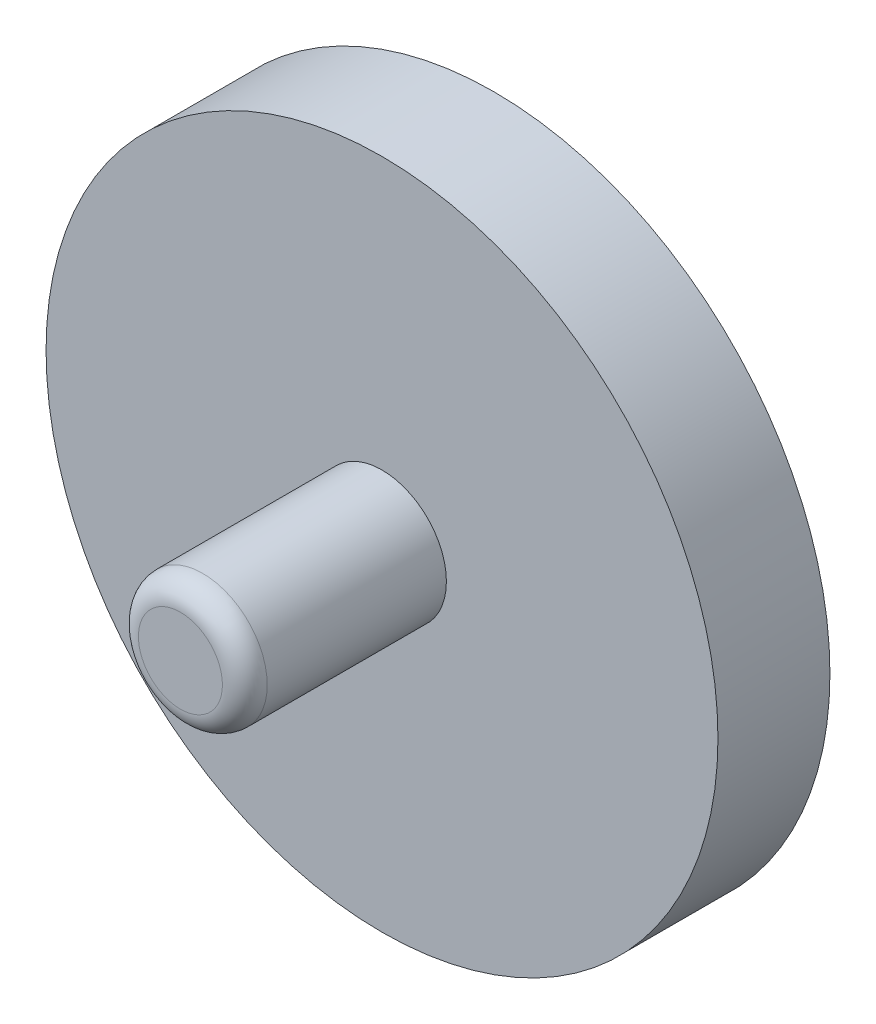
ISO-10303-21;
HEADER;
FILE_DESCRIPTION(('STEP AP214'),'2;1');
FILE_NAME('part.step','',(''),(''),'','','');
FILE_SCHEMA(('AUTOMOTIVE_DESIGN { 1 0 10303 214 1 1 1 1 }'));
ENDSEC;
DATA;
#1=APPLICATION_CONTEXT('core data for automotive mechanical design processes');
#2=APPLICATION_PROTOCOL_DEFINITION('international standard','automotive_design',2000,#1);
#3=PRODUCT_CONTEXT('',#1,'mechanical');
#4=PRODUCT('Part','Part','',(#3));
#5=PRODUCT_RELATED_PRODUCT_CATEGORY('part','',(#4));
#6=PRODUCT_DEFINITION_FORMATION('','',#4);
#7=PRODUCT_DEFINITION_CONTEXT('part definition',#1,'design');
#8=PRODUCT_DEFINITION('design','',#6,#7);
#9=PRODUCT_DEFINITION_SHAPE('','',#8);
#10=(LENGTH_UNIT() NAMED_UNIT(*) SI_UNIT(.MILLI.,.METRE.));
#11=(NAMED_UNIT(*) PLANE_ANGLE_UNIT() SI_UNIT($,.RADIAN.));
#12=(NAMED_UNIT(*) SI_UNIT($,.STERADIAN.) SOLID_ANGLE_UNIT());
#13=UNCERTAINTY_MEASURE_WITH_UNIT(LENGTH_MEASURE(1.E-05),#10,'distance_accuracy_value','');
#14=(GEOMETRIC_REPRESENTATION_CONTEXT(3) GLOBAL_UNCERTAINTY_ASSIGNED_CONTEXT((#13)) GLOBAL_UNIT_ASSIGNED_CONTEXT((#10,
#11,#12)) REPRESENTATION_CONTEXT('',''));
#15=CARTESIAN_POINT('',(0.,0.,0.));
#16=DIRECTION('',(0.,0.,1.));
#17=DIRECTION('',(1.,0.,0.));
#18=AXIS2_PLACEMENT_3D('',#15,#16,#17);
#19=CARTESIAN_POINT('',(0.,0.,2.5));
#20=DIRECTION('',(0.,0.,-1.));
#21=DIRECTION('',(-1.,0.,0.));
#22=AXIS2_PLACEMENT_3D('',#19,#20,#21);
#23=CYLINDRICAL_SURFACE('',#22,7.5);
#24=CARTESIAN_POINT('',(0.,0.,2.5));
#25=DIRECTION('',(0.,0.,1.));
#26=DIRECTION('',(1.,0.,0.));
#27=AXIS2_PLACEMENT_3D('',#24,#25,#26);
#28=CIRCLE('',#27,7.5);
#29=CARTESIAN_POINT('',(7.5,0.,2.5));
#30=VERTEX_POINT('',#29);
#31=EDGE_CURVE('E54',#30,#30,#28,.T.);
#32=ORIENTED_EDGE('',*,*,#31,.F.);
#33=EDGE_LOOP('',(#32));
#34=FACE_BOUND('',#33,.T.);
#35=CARTESIAN_POINT('',(0.,0.,0.));
#36=DIRECTION('',(0.,0.,1.));
#37=DIRECTION('',(1.,0.,0.));
#38=AXIS2_PLACEMENT_3D('',#35,#36,#37);
#39=CIRCLE('',#38,7.5);
#40=CARTESIAN_POINT('',(7.5,0.,0.));
#41=VERTEX_POINT('',#40);
#42=EDGE_CURVE('E57',#41,#41,#39,.T.);
#43=ORIENTED_EDGE('',*,*,#42,.T.);
#44=EDGE_LOOP('',(#43));
#45=FACE_BOUND('',#44,.T.);
#46=ADVANCED_FACE('F39',(#34,#45),#23,.T.);
#47=CARTESIAN_POINT('',(0.,0.,2.5));
#48=DIRECTION('',(0.,0.,1.));
#49=DIRECTION('',(1.,0.,0.));
#50=AXIS2_PLACEMENT_3D('',#47,#48,#49);
#51=PLANE('',#50);
#52=CARTESIAN_POINT('',(0.,0.,2.5));
#53=DIRECTION('',(0.,0.,1.));
#54=DIRECTION('',(1.,0.,0.));
#55=AXIS2_PLACEMENT_3D('',#52,#53,#54);
#56=CIRCLE('',#55,1.4375);
#57=CARTESIAN_POINT('',(1.4375,0.,2.5));
#58=VERTEX_POINT('',#57);
#59=EDGE_CURVE('E50',#58,#58,#56,.T.);
#60=ORIENTED_EDGE('',*,*,#59,.F.);
#61=EDGE_LOOP('',(#60));
#62=FACE_BOUND('',#61,.T.);
#63=ORIENTED_EDGE('',*,*,#31,.T.);
#64=EDGE_LOOP('',(#63));
#65=FACE_BOUND('',#64,.T.);
#66=ADVANCED_FACE('F63',(#62,#65),#51,.T.);
#67=CARTESIAN_POINT('',(0.,0.,0.));
#68=DIRECTION('',(0.,0.,1.));
#69=DIRECTION('',(1.,0.,0.));
#70=AXIS2_PLACEMENT_3D('',#67,#68,#69);
#71=PLANE('',#70);
#72=ORIENTED_EDGE('',*,*,#42,.F.);
#73=EDGE_LOOP('',(#72));
#74=FACE_BOUND('',#73,.T.);
#75=ADVANCED_FACE('F69',(#74),#71,.F.);
#76=CARTESIAN_POINT('',(0.,0.,7.));
#77=DIRECTION('',(0.,0.,-1.));
#78=DIRECTION('',(-1.,0.,0.));
#79=AXIS2_PLACEMENT_3D('',#76,#77,#78);
#80=CYLINDRICAL_SURFACE('',#79,1.4375);
#81=CARTESIAN_POINT('',(0.,0.,6.5));
#82=DIRECTION('',(0.,0.,1.));
#83=DIRECTION('',(1.,0.,0.));
#84=AXIS2_PLACEMENT_3D('',#81,#82,#83);
#85=CIRCLE('',#84,1.4375);
#86=CARTESIAN_POINT('',(1.4375,0.,6.5));
#87=VERTEX_POINT('',#86);
#88=EDGE_CURVE('E10',#87,#87,#85,.F.);
#89=ORIENTED_EDGE('',*,*,#88,.T.);
#90=EDGE_LOOP('',(#89));
#91=FACE_BOUND('',#90,.T.);
#92=ORIENTED_EDGE('',*,*,#59,.T.);
#93=EDGE_LOOP('',(#92));
#94=FACE_BOUND('',#93,.T.);
#95=ADVANCED_FACE('F71',(#91,#94),#80,.T.);
#96=CARTESIAN_POINT('',(0.,0.,7.));
#97=DIRECTION('',(0.,0.,1.));
#98=DIRECTION('',(1.,0.,0.));
#99=AXIS2_PLACEMENT_3D('',#96,#97,#98);
#100=PLANE('',#99);
#101=CARTESIAN_POINT('',(0.,0.,7.));
#102=DIRECTION('',(0.,0.,1.));
#103=DIRECTION('',(1.,0.,0.));
#104=AXIS2_PLACEMENT_3D('',#101,#102,#103);
#105=CIRCLE('',#104,0.9375);
#106=CARTESIAN_POINT('',(0.9375,0.,7.));
#107=VERTEX_POINT('',#106);
#108=EDGE_CURVE('E46',#107,#107,#105,.T.);
#109=ORIENTED_EDGE('',*,*,#108,.T.);
#110=EDGE_LOOP('',(#109));
#111=FACE_BOUND('',#110,.T.);
#112=ADVANCED_FACE('F77',(#111),#100,.T.);
#113=CARTESIAN_POINT('',(0.,0.,6.5));
#114=DIRECTION('',(0.,0.,1.));
#115=DIRECTION('',(1.,0.,0.));
#116=AXIS2_PLACEMENT_3D('',#113,#114,#115);
#117=TOROIDAL_SURFACE('',#116,0.9375,0.5);
#118=ORIENTED_EDGE('',*,*,#88,.F.);
#119=EDGE_LOOP('',(#118));
#120=FACE_BOUND('',#119,.T.);
#121=ORIENTED_EDGE('',*,*,#108,.F.);
#122=EDGE_LOOP('',(#121));
#123=FACE_BOUND('',#122,.T.);
#124=ADVANCED_FACE('F41',(#120,#123),#117,.T.);
#125=CLOSED_SHELL('',(#46,#66,#75,#95,#112,#124));
#126=MANIFOLD_SOLID_BREP('B2',#125);
#127=ADVANCED_BREP_SHAPE_REPRESENTATION('',(#18,#126),#14);
#128=SHAPE_DEFINITION_REPRESENTATION(#9,#127);
ENDSEC;
END-ISO-10303-21;
